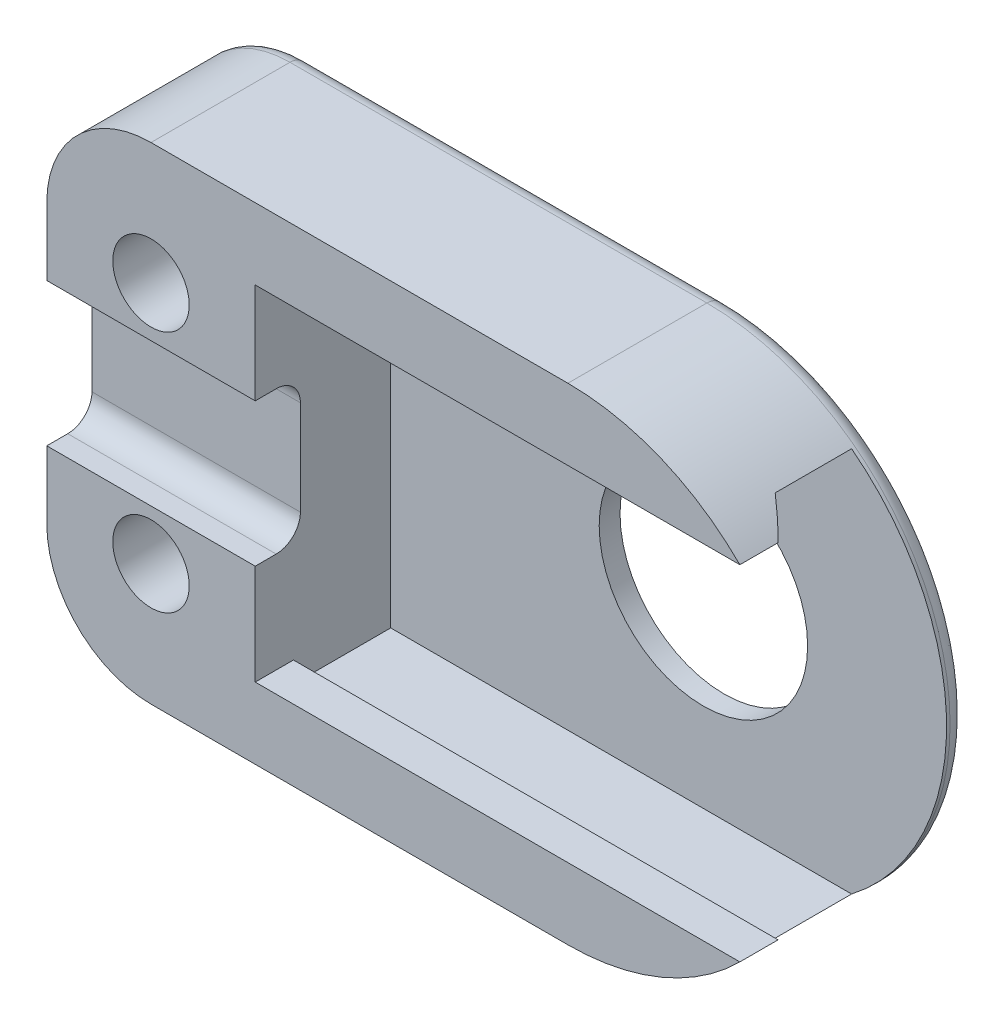
ISO-10303-21;
HEADER;
FILE_DESCRIPTION(('STEP AP214'),'2;1');
FILE_NAME('part.step','',(''),(''),'','','');
FILE_SCHEMA(('AUTOMOTIVE_DESIGN { 1 0 10303 214 1 1 1 1 }'));
ENDSEC;
DATA;
#1=APPLICATION_CONTEXT('core data for automotive mechanical design processes');
#2=APPLICATION_PROTOCOL_DEFINITION('international standard','automotive_design',2000,#1);
#3=PRODUCT_CONTEXT('',#1,'mechanical');
#4=PRODUCT('Part','Part','',(#3));
#5=PRODUCT_RELATED_PRODUCT_CATEGORY('part','',(#4));
#6=PRODUCT_DEFINITION_FORMATION('','',#4);
#7=PRODUCT_DEFINITION_CONTEXT('part definition',#1,'design');
#8=PRODUCT_DEFINITION('design','',#6,#7);
#9=PRODUCT_DEFINITION_SHAPE('','',#8);
#10=(LENGTH_UNIT() NAMED_UNIT(*) SI_UNIT(.MILLI.,.METRE.));
#11=(NAMED_UNIT(*) PLANE_ANGLE_UNIT() SI_UNIT($,.RADIAN.));
#12=(NAMED_UNIT(*) SI_UNIT($,.STERADIAN.) SOLID_ANGLE_UNIT());
#13=UNCERTAINTY_MEASURE_WITH_UNIT(LENGTH_MEASURE(1.E-05),#10,'distance_accuracy_value','');
#14=(GEOMETRIC_REPRESENTATION_CONTEXT(3) GLOBAL_UNCERTAINTY_ASSIGNED_CONTEXT((#13)) GLOBAL_UNIT_ASSIGNED_CONTEXT((#10,
#11,#12)) REPRESENTATION_CONTEXT('',''));
#15=CARTESIAN_POINT('',(0.,0.,0.));
#16=DIRECTION('',(0.,0.,1.));
#17=DIRECTION('',(1.,0.,0.));
#18=AXIS2_PLACEMENT_3D('',#15,#16,#17);
#19=CARTESIAN_POINT('',(0.,0.,4.5));
#20=DIRECTION('',(0.,0.,-1.));
#21=DIRECTION('',(-1.,0.,0.));
#22=AXIS2_PLACEMENT_3D('',#19,#20,#21);
#23=PLANE('',#22);
#24=CARTESIAN_POINT('',(-12.,3.5,4.5));
#25=DIRECTION('',(0.,0.,1.));
#26=DIRECTION('',(1.,0.,0.));
#27=AXIS2_PLACEMENT_3D('',#24,#25,#26);
#28=CIRCLE('',#27,1.1);
#29=CARTESIAN_POINT('',(-10.9,3.5,4.5));
#30=VERTEX_POINT('',#29);
#31=EDGE_CURVE('E285',#30,#30,#28,.T.);
#32=ORIENTED_EDGE('',*,*,#31,.F.);
#33=EDGE_LOOP('',(#32));
#34=FACE_BOUND('',#33,.T.);
#35=DIRECTION('',(-1.,0.,0.));
#36=VECTOR('',#35,1.);
#37=CARTESIAN_POINT('',(-15.,7.,4.5));
#38=LINE('',#37,#36);
#39=CARTESIAN_POINT('',(0.,7.,4.5));
#40=VERTEX_POINT('',#39);
#41=CARTESIAN_POINT('',(-12.,7.,4.5));
#42=VERTEX_POINT('',#41);
#43=EDGE_CURVE('E292',#40,#42,#38,.T.);
#44=ORIENTED_EDGE('',*,*,#43,.T.);
#45=CARTESIAN_POINT('',(-12.,4.,4.5));
#46=DIRECTION('',(0.,0.,-1.));
#47=DIRECTION('',(-1.,0.,0.));
#48=AXIS2_PLACEMENT_3D('',#45,#46,#47);
#49=CIRCLE('',#48,3.);
#50=CARTESIAN_POINT('',(-15.,4.,4.5));
#51=VERTEX_POINT('',#50);
#52=EDGE_CURVE('E341',#42,#51,#49,.F.);
#53=ORIENTED_EDGE('',*,*,#52,.T.);
#54=DIRECTION('',(0.,-1.,0.));
#55=VECTOR('',#54,1.);
#56=CARTESIAN_POINT('',(-15.,7.,4.5));
#57=LINE('',#56,#55);
#58=CARTESIAN_POINT('',(-15.,2.06,4.5));
#59=VERTEX_POINT('',#58);
#60=EDGE_CURVE('E296',#51,#59,#57,.T.);
#61=ORIENTED_EDGE('',*,*,#60,.T.);
#62=DIRECTION('',(-1.,0.,0.));
#63=VECTOR('',#62,1.);
#64=CARTESIAN_POINT('',(7.,2.06,4.5));
#65=LINE('',#64,#63);
#66=CARTESIAN_POINT('',(-9.,2.06,4.5));
#67=VERTEX_POINT('',#66);
#68=EDGE_CURVE('E208',#67,#59,#65,.T.);
#69=ORIENTED_EDGE('',*,*,#68,.F.);
#70=DIRECTION('',(0.,1.,0.));
#71=VECTOR('',#70,1.);
#72=CARTESIAN_POINT('',(-9.,0.,4.5));
#73=LINE('',#72,#71);
#74=CARTESIAN_POINT('',(-9.,4.95,4.5));
#75=VERTEX_POINT('',#74);
#76=EDGE_CURVE('E245',#67,#75,#73,.T.);
#77=ORIENTED_EDGE('',*,*,#76,.T.);
#78=DIRECTION('',(-1.,0.,0.));
#79=VECTOR('',#78,1.);
#80=CARTESIAN_POINT('',(7.,4.95,4.5));
#81=LINE('',#80,#79);
#82=CARTESIAN_POINT('',(4.94949492372707,4.95,4.5));
#83=VERTEX_POINT('',#82);
#84=EDGE_CURVE('E266',#83,#75,#81,.T.);
#85=ORIENTED_EDGE('',*,*,#84,.F.);
#86=CARTESIAN_POINT('',(0.,0.,4.5));
#87=DIRECTION('',(0.,0.,1.));
#88=DIRECTION('',(-1.,0.,0.));
#89=AXIS2_PLACEMENT_3D('',#86,#87,#88);
#90=CIRCLE('',#89,7.);
#91=EDGE_CURVE('E288',#83,#40,#90,.T.);
#92=ORIENTED_EDGE('',*,*,#91,.T.);
#93=EDGE_LOOP('',(#44,#53,#61,#69,#77,#85,#92));
#94=FACE_BOUND('',#93,.T.);
#95=ADVANCED_FACE('F34',(#34,#94),#23,.F.);
#96=CARTESIAN_POINT('',(-12.,-3.5,4.5));
#97=DIRECTION('',(0.,0.,1.));
#98=DIRECTION('',(-1.,0.,0.));
#99=AXIS2_PLACEMENT_3D('',#96,#97,#98);
#100=CIRCLE('',#99,1.1);
#101=CARTESIAN_POINT('',(-13.1,-3.5,4.5));
#102=VERTEX_POINT('',#101);
#103=EDGE_CURVE('E282',#102,#102,#100,.T.);
#104=ORIENTED_EDGE('',*,*,#103,.F.);
#105=EDGE_LOOP('',(#104));
#106=FACE_BOUND('',#105,.T.);
#107=CARTESIAN_POINT('',(-15.,-2.06,4.5));
#108=VERTEX_POINT('',#107);
#109=CARTESIAN_POINT('',(-15.,-4.,4.5));
#110=VERTEX_POINT('',#109);
#111=EDGE_CURVE('E295',#108,#110,#57,.T.);
#112=ORIENTED_EDGE('',*,*,#111,.T.);
#113=CARTESIAN_POINT('',(-12.,-4.,4.5));
#114=DIRECTION('',(0.,0.,-1.));
#115=DIRECTION('',(-1.,0.,0.));
#116=AXIS2_PLACEMENT_3D('',#113,#114,#115);
#117=CIRCLE('',#116,3.);
#118=CARTESIAN_POINT('',(-12.,-7.,4.5));
#119=VERTEX_POINT('',#118);
#120=EDGE_CURVE('E345',#110,#119,#117,.F.);
#121=ORIENTED_EDGE('',*,*,#120,.T.);
#122=DIRECTION('',(1.,0.,0.));
#123=VECTOR('',#122,1.);
#124=CARTESIAN_POINT('',(-15.,-7.,4.5));
#125=LINE('',#124,#123);
#126=CARTESIAN_POINT('',(0.,-7.,4.5));
#127=VERTEX_POINT('',#126);
#128=EDGE_CURVE('E298',#119,#127,#125,.T.);
#129=ORIENTED_EDGE('',*,*,#128,.T.);
#130=CARTESIAN_POINT('',(4.94949492372707,-4.95,4.5));
#131=VERTEX_POINT('',#130);
#132=EDGE_CURVE('E289',#127,#131,#90,.T.);
#133=ORIENTED_EDGE('',*,*,#132,.T.);
#134=DIRECTION('',(-1.,0.,0.));
#135=VECTOR('',#134,1.);
#136=CARTESIAN_POINT('',(7.,-4.95,4.5));
#137=LINE('',#136,#135);
#138=CARTESIAN_POINT('',(-9.,-4.95,4.5));
#139=VERTEX_POINT('',#138);
#140=EDGE_CURVE('E269',#131,#139,#137,.T.);
#141=ORIENTED_EDGE('',*,*,#140,.T.);
#142=CARTESIAN_POINT('',(-9.,-2.06,4.5));
#143=VERTEX_POINT('',#142);
#144=EDGE_CURVE('E246',#139,#143,#73,.T.);
#145=ORIENTED_EDGE('',*,*,#144,.T.);
#146=DIRECTION('',(-1.,0.,0.));
#147=VECTOR('',#146,1.);
#148=CARTESIAN_POINT('',(7.,-2.06,4.5));
#149=LINE('',#148,#147);
#150=EDGE_CURVE('E226',#143,#108,#149,.T.);
#151=ORIENTED_EDGE('',*,*,#150,.T.);
#152=EDGE_LOOP('',(#112,#121,#129,#133,#141,#145,#151));
#153=FACE_BOUND('',#152,.T.);
#154=ADVANCED_FACE('F424',(#106,#153),#23,.F.);
#155=CARTESIAN_POINT('',(0.,0.,0.));
#156=DIRECTION('',(0.,0.,-1.));
#157=DIRECTION('',(-1.,0.,0.));
#158=AXIS2_PLACEMENT_3D('',#155,#156,#157);
#159=PLANE('',#158);
#160=CARTESIAN_POINT('',(-12.,3.5,0.));
#161=DIRECTION('',(0.,0.,1.));
#162=DIRECTION('',(1.,0.,0.));
#163=AXIS2_PLACEMENT_3D('',#160,#161,#162);
#164=CIRCLE('',#163,1.75);
#165=CARTESIAN_POINT('',(-10.25,3.5,0.));
#166=VERTEX_POINT('',#165);
#167=EDGE_CURVE('E391',#166,#166,#164,.T.);
#168=ORIENTED_EDGE('',*,*,#167,.T.);
#169=EDGE_LOOP('',(#168));
#170=FACE_BOUND('',#169,.T.);
#171=CARTESIAN_POINT('',(-12.,-3.5,0.));
#172=DIRECTION('',(0.,0.,1.));
#173=DIRECTION('',(1.,0.,0.));
#174=AXIS2_PLACEMENT_3D('',#171,#172,#173);
#175=CIRCLE('',#174,1.75);
#176=CARTESIAN_POINT('',(-10.25,-3.5,0.));
#177=VERTEX_POINT('',#176);
#178=EDGE_CURVE('E400',#177,#177,#175,.T.);
#179=ORIENTED_EDGE('',*,*,#178,.T.);
#180=EDGE_LOOP('',(#179));
#181=FACE_BOUND('',#180,.T.);
#182=DIRECTION('',(0.,-1.,0.));
#183=VECTOR('',#182,1.);
#184=CARTESIAN_POINT('',(-14.5,4.,0.));
#185=LINE('',#184,#183);
#186=CARTESIAN_POINT('',(-14.5,-4.,0.));
#187=VERTEX_POINT('',#186);
#188=CARTESIAN_POINT('',(-14.5,4.,0.));
#189=VERTEX_POINT('',#188);
#190=EDGE_CURVE('E347',#187,#189,#185,.F.);
#191=ORIENTED_EDGE('',*,*,#190,.T.);
#192=CARTESIAN_POINT('',(-12.,4.,0.));
#193=DIRECTION('',(0.,0.,-1.));
#194=DIRECTION('',(-1.,0.,0.));
#195=AXIS2_PLACEMENT_3D('',#192,#193,#194);
#196=CIRCLE('',#195,2.5);
#197=CARTESIAN_POINT('',(-12.,6.5,0.));
#198=VERTEX_POINT('',#197);
#199=EDGE_CURVE('E357',#189,#198,#196,.T.);
#200=ORIENTED_EDGE('',*,*,#199,.T.);
#201=DIRECTION('',(-1.,0.,0.));
#202=VECTOR('',#201,1.);
#203=CARTESIAN_POINT('',(0.,6.5,0.));
#204=LINE('',#203,#202);
#205=CARTESIAN_POINT('',(0.,6.5,0.));
#206=VERTEX_POINT('',#205);
#207=EDGE_CURVE('E355',#198,#206,#204,.F.);
#208=ORIENTED_EDGE('',*,*,#207,.T.);
#209=CARTESIAN_POINT('',(0.,0.,0.));
#210=DIRECTION('',(0.,0.,-1.));
#211=DIRECTION('',(-1.,0.,0.));
#212=AXIS2_PLACEMENT_3D('',#209,#210,#211);
#213=CIRCLE('',#212,6.5);
#214=CARTESIAN_POINT('',(0.,-6.5,0.));
#215=VERTEX_POINT('',#214);
#216=EDGE_CURVE('E353',#206,#215,#213,.T.);
#217=ORIENTED_EDGE('',*,*,#216,.T.);
#218=DIRECTION('',(1.,0.,0.));
#219=VECTOR('',#218,1.);
#220=CARTESIAN_POINT('',(-12.,-6.5,0.));
#221=LINE('',#220,#219);
#222=CARTESIAN_POINT('',(-12.,-6.5,0.));
#223=VERTEX_POINT('',#222);
#224=EDGE_CURVE('E351',#215,#223,#221,.F.);
#225=ORIENTED_EDGE('',*,*,#224,.T.);
#226=CARTESIAN_POINT('',(-12.,-4.,0.));
#227=DIRECTION('',(0.,0.,-1.));
#228=DIRECTION('',(-1.,0.,0.));
#229=AXIS2_PLACEMENT_3D('',#226,#227,#228);
#230=CIRCLE('',#229,2.5);
#231=EDGE_CURVE('E349',#223,#187,#230,.T.);
#232=ORIENTED_EDGE('',*,*,#231,.T.);
#233=EDGE_LOOP('',(#191,#200,#208,#217,#225,#232));
#234=FACE_BOUND('',#233,.T.);
#235=CARTESIAN_POINT('',(0.,0.,0.));
#236=DIRECTION('',(0.,0.,-1.));
#237=DIRECTION('',(-1.,0.,0.));
#238=AXIS2_PLACEMENT_3D('',#235,#236,#237);
#239=CIRCLE('',#238,3.);
#240=CARTESIAN_POINT('',(-3.,0.,0.));
#241=VERTEX_POINT('',#240);
#242=EDGE_CURVE('E279',#241,#241,#239,.T.);
#243=ORIENTED_EDGE('',*,*,#242,.F.);
#244=EDGE_LOOP('',(#243));
#245=FACE_BOUND('',#244,.T.);
#246=ADVANCED_FACE('F404',(#170,#181,#234,#245),#159,.T.);
#247=CARTESIAN_POINT('',(0.,0.,4.5));
#248=DIRECTION('',(0.,0.,-1.));
#249=DIRECTION('',(-1.,0.,0.));
#250=AXIS2_PLACEMENT_3D('',#247,#248,#249);
#251=CYLINDRICAL_SURFACE('',#250,7.);
#252=DIRECTION('',(0.,0.,-1.));
#253=VECTOR('',#252,1.);
#254=CARTESIAN_POINT('',(0.,-7.,4.5));
#255=LINE('',#254,#253);
#256=CARTESIAN_POINT('',(0.,-7.,0.5));
#257=VERTEX_POINT('',#256);
#258=EDGE_CURVE('E300',#127,#257,#255,.T.);
#259=ORIENTED_EDGE('',*,*,#258,.T.);
#260=CARTESIAN_POINT('',(0.,0.,0.5));
#261=DIRECTION('',(0.,0.,-1.));
#262=DIRECTION('',(-1.,0.,0.));
#263=AXIS2_PLACEMENT_3D('',#260,#261,#262);
#264=CIRCLE('',#263,7.);
#265=CARTESIAN_POINT('',(0.,7.,0.5));
#266=VERTEX_POINT('',#265);
#267=EDGE_CURVE('E365',#257,#266,#264,.F.);
#268=ORIENTED_EDGE('',*,*,#267,.T.);
#269=DIRECTION('',(0.,0.,-1.));
#270=VECTOR('',#269,1.);
#271=CARTESIAN_POINT('',(0.,7.,4.5));
#272=LINE('',#271,#270);
#273=EDGE_CURVE('E303',#40,#266,#272,.T.);
#274=ORIENTED_EDGE('',*,*,#273,.F.);
#275=ORIENTED_EDGE('',*,*,#91,.F.);
#276=DIRECTION('',(0.,0.,-1.));
#277=VECTOR('',#276,1.);
#278=CARTESIAN_POINT('',(4.94949492372707,4.95,4.5));
#279=LINE('',#278,#277);
#280=CARTESIAN_POINT('',(4.94949492372707,4.95,3.40000000000002));
#281=VERTEX_POINT('',#280);
#282=EDGE_CURVE('E317',#281,#83,#279,.F.);
#283=ORIENTED_EDGE('',*,*,#282,.F.);
#284=CARTESIAN_POINT('',(0.,0.,8.35000000000015));
#285=DIRECTION('',(0.,-0.707106781186557,-0.707106781186538));
#286=DIRECTION('',(0.,0.707106781186538,-0.707106781186557));
#287=AXIS2_PLACEMENT_3D('',#284,#285,#286);
#288=ELLIPSE('',#287,9.8994949366118,7.);
#289=CARTESIAN_POINT('',(4.26585278695831,5.55,2.8));
#290=VERTEX_POINT('',#289);
#291=EDGE_CURVE('E319',#290,#281,#288,.T.);
#292=ORIENTED_EDGE('',*,*,#291,.F.);
#293=DIRECTION('',(0.,0.,-1.));
#294=VECTOR('',#293,1.);
#295=CARTESIAN_POINT('',(4.26585278695831,5.55,4.5));
#296=LINE('',#295,#294);
#297=CARTESIAN_POINT('',(4.26585278695831,5.55,0.6));
#298=VERTEX_POINT('',#297);
#299=EDGE_CURVE('E321',#298,#290,#296,.F.);
#300=ORIENTED_EDGE('',*,*,#299,.F.);
#301=CARTESIAN_POINT('',(0.,0.,0.6));
#302=DIRECTION('',(0.,0.,-1.));
#303=DIRECTION('',(-1.,0.,0.));
#304=AXIS2_PLACEMENT_3D('',#301,#302,#303);
#305=CIRCLE('',#304,7.);
#306=CARTESIAN_POINT('',(4.26585278695831,-5.55,0.6));
#307=VERTEX_POINT('',#306);
#308=EDGE_CURVE('E277',#298,#307,#305,.T.);
#309=ORIENTED_EDGE('',*,*,#308,.T.);
#310=DIRECTION('',(0.,0.,-1.));
#311=VECTOR('',#310,1.);
#312=CARTESIAN_POINT('',(4.26585278695831,-5.55,4.5));
#313=LINE('',#312,#311);
#314=CARTESIAN_POINT('',(4.26585278695831,-5.55,2.8));
#315=VERTEX_POINT('',#314);
#316=EDGE_CURVE('E306',#307,#315,#313,.F.);
#317=ORIENTED_EDGE('',*,*,#316,.T.);
#318=CARTESIAN_POINT('',(0.,0.,8.35000000000013));
#319=DIRECTION('',(0.,-0.707106781186556,0.707106781186539));
#320=DIRECTION('',(0.,-0.707106781186539,-0.707106781186556));
#321=AXIS2_PLACEMENT_3D('',#318,#319,#320);
#322=ELLIPSE('',#321,9.89949493661178,7.);
#323=CARTESIAN_POINT('',(4.94949492372707,-4.95,3.40000000000002));
#324=VERTEX_POINT('',#323);
#325=EDGE_CURVE('E311',#315,#324,#322,.T.);
#326=ORIENTED_EDGE('',*,*,#325,.T.);
#327=DIRECTION('',(0.,0.,-1.));
#328=VECTOR('',#327,1.);
#329=CARTESIAN_POINT('',(4.94949492372707,-4.95,4.5));
#330=LINE('',#329,#328);
#331=EDGE_CURVE('E314',#324,#131,#330,.F.);
#332=ORIENTED_EDGE('',*,*,#331,.T.);
#333=ORIENTED_EDGE('',*,*,#132,.F.);
#334=EDGE_LOOP('',(#259,#268,#274,#275,#283,#292,#300,#309,#317,#326,#332,#333));
#335=FACE_BOUND('',#334,.T.);
#336=ADVANCED_FACE('F439',(#335),#251,.T.);
#337=CARTESIAN_POINT('',(-15.,7.,4.5));
#338=DIRECTION('',(0.,-1.,0.));
#339=DIRECTION('',(0.,0.,-1.));
#340=AXIS2_PLACEMENT_3D('',#337,#338,#339);
#341=PLANE('',#340);
#342=ORIENTED_EDGE('',*,*,#273,.T.);
#343=DIRECTION('',(-1.,0.,0.));
#344=VECTOR('',#343,1.);
#345=CARTESIAN_POINT('',(-12.,7.,0.5));
#346=LINE('',#345,#344);
#347=CARTESIAN_POINT('',(-12.,7.,0.5));
#348=VERTEX_POINT('',#347);
#349=EDGE_CURVE('E363',#266,#348,#346,.T.);
#350=ORIENTED_EDGE('',*,*,#349,.T.);
#351=DIRECTION('',(0.,0.,-1.));
#352=VECTOR('',#351,1.);
#353=CARTESIAN_POINT('',(-12.,7.,4.5));
#354=LINE('',#353,#352);
#355=EDGE_CURVE('E339',#348,#42,#354,.F.);
#356=ORIENTED_EDGE('',*,*,#355,.T.);
#357=ORIENTED_EDGE('',*,*,#43,.F.);
#358=EDGE_LOOP('',(#342,#350,#356,#357));
#359=FACE_BOUND('',#358,.T.);
#360=ADVANCED_FACE('F447',(#359),#341,.F.);
#361=CARTESIAN_POINT('',(-15.,7.,4.5));
#362=DIRECTION('',(1.,0.,0.));
#363=DIRECTION('',(0.,1.,0.));
#364=AXIS2_PLACEMENT_3D('',#361,#362,#363);
#365=PLANE('',#364);
#366=DIRECTION('',(0.,0.,-1.));
#367=VECTOR('',#366,1.);
#368=CARTESIAN_POINT('',(-15.,4.,4.5));
#369=LINE('',#368,#367);
#370=CARTESIAN_POINT('',(-15.,4.,0.5));
#371=VERTEX_POINT('',#370);
#372=EDGE_CURVE('E337',#51,#371,#369,.T.);
#373=ORIENTED_EDGE('',*,*,#372,.T.);
#374=DIRECTION('',(0.,-1.,0.));
#375=VECTOR('',#374,1.);
#376=CARTESIAN_POINT('',(-15.,-4.,0.5));
#377=LINE('',#376,#375);
#378=CARTESIAN_POINT('',(-15.,-4.,0.5));
#379=VERTEX_POINT('',#378);
#380=EDGE_CURVE('E11',#371,#379,#377,.T.);
#381=ORIENTED_EDGE('',*,*,#380,.T.);
#382=DIRECTION('',(0.,0.,-1.));
#383=VECTOR('',#382,1.);
#384=CARTESIAN_POINT('',(-15.,-4.,4.5));
#385=LINE('',#384,#383);
#386=EDGE_CURVE('E335',#379,#110,#385,.F.);
#387=ORIENTED_EDGE('',*,*,#386,.T.);
#388=ORIENTED_EDGE('',*,*,#111,.F.);
#389=DIRECTION('',(0.,0.,1.));
#390=VECTOR('',#389,1.);
#391=CARTESIAN_POINT('',(-15.,-2.06,4.5));
#392=LINE('',#391,#390);
#393=CARTESIAN_POINT('',(-15.,-2.06,3.89665998448863));
#394=VERTEX_POINT('',#393);
#395=EDGE_CURVE('E201',#394,#108,#392,.T.);
#396=ORIENTED_EDGE('',*,*,#395,.F.);
#397=CARTESIAN_POINT('',(-15.,-1.36334001551137,3.89665998448863));
#398=DIRECTION('',(-1.,0.,0.));
#399=DIRECTION('',(0.,1.,0.));
#400=AXIS2_PLACEMENT_3D('',#397,#398,#399);
#401=CIRCLE('',#400,0.696659984488627);
#402=CARTESIAN_POINT('',(-15.,-1.36334001551137,3.2));
#403=VERTEX_POINT('',#402);
#404=EDGE_CURVE('E217',#403,#394,#401,.T.);
#405=ORIENTED_EDGE('',*,*,#404,.F.);
#406=DIRECTION('',(0.,-1.,0.));
#407=VECTOR('',#406,1.);
#408=CARTESIAN_POINT('',(-15.,1.36334001551137,3.2));
#409=LINE('',#408,#407);
#410=CARTESIAN_POINT('',(-15.,1.36334001551137,3.2));
#411=VERTEX_POINT('',#410);
#412=EDGE_CURVE('E215',#411,#403,#409,.T.);
#413=ORIENTED_EDGE('',*,*,#412,.F.);
#414=CARTESIAN_POINT('',(-15.,1.36334001551137,3.89665998448863));
#415=DIRECTION('',(-1.,0.,0.));
#416=DIRECTION('',(0.,-1.,0.));
#417=AXIS2_PLACEMENT_3D('',#414,#415,#416);
#418=CIRCLE('',#417,0.696659984488628);
#419=CARTESIAN_POINT('',(-15.,2.06,3.89665998448863));
#420=VERTEX_POINT('',#419);
#421=EDGE_CURVE('E194',#420,#411,#418,.T.);
#422=ORIENTED_EDGE('',*,*,#421,.F.);
#423=DIRECTION('',(0.,0.,-1.));
#424=VECTOR('',#423,1.);
#425=CARTESIAN_POINT('',(-15.,2.06,4.5));
#426=LINE('',#425,#424);
#427=EDGE_CURVE('E205',#59,#420,#426,.T.);
#428=ORIENTED_EDGE('',*,*,#427,.F.);
#429=ORIENTED_EDGE('',*,*,#60,.F.);
#430=EDGE_LOOP('',(#373,#381,#387,#388,#396,#405,#413,#422,#428,#429));
#431=FACE_BOUND('',#430,.T.);
#432=ADVANCED_FACE('F212',(#431),#365,.F.);
#433=CARTESIAN_POINT('',(-15.,-7.,4.5));
#434=DIRECTION('',(0.,1.,0.));
#435=DIRECTION('',(0.,0.,1.));
#436=AXIS2_PLACEMENT_3D('',#433,#434,#435);
#437=PLANE('',#436);
#438=DIRECTION('',(0.,0.,-1.));
#439=VECTOR('',#438,1.);
#440=CARTESIAN_POINT('',(-12.,-7.,4.5));
#441=LINE('',#440,#439);
#442=CARTESIAN_POINT('',(-12.,-7.,0.5));
#443=VERTEX_POINT('',#442);
#444=EDGE_CURVE('E343',#119,#443,#441,.T.);
#445=ORIENTED_EDGE('',*,*,#444,.T.);
#446=DIRECTION('',(1.,0.,0.));
#447=VECTOR('',#446,1.);
#448=CARTESIAN_POINT('',(0.,-7.,0.5));
#449=LINE('',#448,#447);
#450=EDGE_CURVE('E367',#443,#257,#449,.T.);
#451=ORIENTED_EDGE('',*,*,#450,.T.);
#452=ORIENTED_EDGE('',*,*,#258,.F.);
#453=ORIENTED_EDGE('',*,*,#128,.F.);
#454=EDGE_LOOP('',(#445,#451,#452,#453));
#455=FACE_BOUND('',#454,.T.);
#456=ADVANCED_FACE('F441',(#455),#437,.F.);
#457=CARTESIAN_POINT('',(-12.,3.5,4.5));
#458=DIRECTION('',(0.,0.,-1.));
#459=DIRECTION('',(-1.,0.,0.));
#460=AXIS2_PLACEMENT_3D('',#457,#458,#459);
#461=CYLINDRICAL_SURFACE('',#460,1.1);
#462=CARTESIAN_POINT('',(-12.,3.5,1.));
#463=DIRECTION('',(0.,0.,1.));
#464=DIRECTION('',(1.,0.,0.));
#465=AXIS2_PLACEMENT_3D('',#462,#463,#464);
#466=CIRCLE('',#465,1.1);
#467=CARTESIAN_POINT('',(-10.9,3.5,1.));
#468=VERTEX_POINT('',#467);
#469=EDGE_CURVE('E38',#468,#468,#466,.T.);
#470=ORIENTED_EDGE('',*,*,#469,.F.);
#471=EDGE_LOOP('',(#470));
#472=FACE_BOUND('',#471,.T.);
#473=ORIENTED_EDGE('',*,*,#31,.T.);
#474=EDGE_LOOP('',(#473));
#475=FACE_BOUND('',#474,.T.);
#476=ADVANCED_FACE('F435',(#472,#475),#461,.F.);
#477=CARTESIAN_POINT('',(-12.,-3.5,4.5));
#478=DIRECTION('',(0.,0.,-1.));
#479=DIRECTION('',(-1.,0.,0.));
#480=AXIS2_PLACEMENT_3D('',#477,#478,#479);
#481=CYLINDRICAL_SURFACE('',#480,1.1);
#482=CARTESIAN_POINT('',(-12.,-3.5,1.));
#483=DIRECTION('',(0.,0.,1.));
#484=DIRECTION('',(1.,0.,0.));
#485=AXIS2_PLACEMENT_3D('',#482,#483,#484);
#486=CIRCLE('',#485,1.1);
#487=CARTESIAN_POINT('',(-10.9,-3.5,1.));
#488=VERTEX_POINT('',#487);
#489=EDGE_CURVE('E384',#488,#488,#486,.T.);
#490=ORIENTED_EDGE('',*,*,#489,.F.);
#491=EDGE_LOOP('',(#490));
#492=FACE_BOUND('',#491,.T.);
#493=ORIENTED_EDGE('',*,*,#103,.T.);
#494=EDGE_LOOP('',(#493));
#495=FACE_BOUND('',#494,.T.);
#496=ADVANCED_FACE('F526',(#492,#495),#481,.F.);
#497=CARTESIAN_POINT('',(0.,0.,10.));
#498=DIRECTION('',(0.,0.,-1.));
#499=DIRECTION('',(-1.,0.,0.));
#500=AXIS2_PLACEMENT_3D('',#497,#498,#499);
#501=CYLINDRICAL_SURFACE('',#500,3.);
#502=CARTESIAN_POINT('',(0.,0.,0.6));
#503=DIRECTION('',(0.,0.,-1.));
#504=DIRECTION('',(-1.,0.,0.));
#505=AXIS2_PLACEMENT_3D('',#502,#503,#504);
#506=CIRCLE('',#505,3.);
#507=CARTESIAN_POINT('',(-3.,0.,0.6));
#508=VERTEX_POINT('',#507);
#509=EDGE_CURVE('E261',#508,#508,#506,.F.);
#510=ORIENTED_EDGE('',*,*,#509,.T.);
#511=EDGE_LOOP('',(#510));
#512=FACE_BOUND('',#511,.T.);
#513=ORIENTED_EDGE('',*,*,#242,.T.);
#514=EDGE_LOOP('',(#513));
#515=FACE_BOUND('',#514,.T.);
#516=ADVANCED_FACE('F523',(#512,#515),#501,.F.);
#517=CARTESIAN_POINT('',(7.,5.55,0.));
#518=DIRECTION('',(0.,-1.,0.));
#519=DIRECTION('',(0.,0.,-1.));
#520=AXIS2_PLACEMENT_3D('',#517,#518,#519);
#521=PLANE('',#520);
#522=ORIENTED_EDGE('',*,*,#299,.T.);
#523=DIRECTION('',(-1.,0.,0.));
#524=VECTOR('',#523,1.);
#525=CARTESIAN_POINT('',(7.,5.55,2.8));
#526=LINE('',#525,#524);
#527=CARTESIAN_POINT('',(-9.,5.55,2.8));
#528=VERTEX_POINT('',#527);
#529=EDGE_CURVE('E262',#290,#528,#526,.T.);
#530=ORIENTED_EDGE('',*,*,#529,.T.);
#531=DIRECTION('',(0.,0.,1.));
#532=VECTOR('',#531,1.);
#533=CARTESIAN_POINT('',(-9.,5.55,0.));
#534=LINE('',#533,#532);
#535=CARTESIAN_POINT('',(-9.,5.55,0.6));
#536=VERTEX_POINT('',#535);
#537=EDGE_CURVE('E255',#536,#528,#534,.T.);
#538=ORIENTED_EDGE('',*,*,#537,.F.);
#539=DIRECTION('',(-1.,0.,0.));
#540=VECTOR('',#539,1.);
#541=CARTESIAN_POINT('',(7.,5.55,0.6));
#542=LINE('',#541,#540);
#543=EDGE_CURVE('E259',#298,#536,#542,.T.);
#544=ORIENTED_EDGE('',*,*,#543,.F.);
#545=EDGE_LOOP('',(#522,#530,#538,#544));
#546=FACE_BOUND('',#545,.T.);
#547=ADVANCED_FACE('F525',(#546),#521,.T.);
#548=CARTESIAN_POINT('',(7.,4.17500000000007,4.17499999999996));
#549=DIRECTION('',(0.,-0.707106781186557,-0.707106781186538));
#550=DIRECTION('',(0.,0.707106781186538,-0.707106781186557));
#551=AXIS2_PLACEMENT_3D('',#548,#549,#550);
#552=PLANE('',#551);
#553=ORIENTED_EDGE('',*,*,#291,.T.);
#554=DIRECTION('',(-1.,0.,0.));
#555=VECTOR('',#554,1.);
#556=CARTESIAN_POINT('',(7.,4.95,3.40000000000002));
#557=LINE('',#556,#555);
#558=CARTESIAN_POINT('',(-9.,4.95,3.40000000000002));
#559=VERTEX_POINT('',#558);
#560=EDGE_CURVE('E264',#281,#559,#557,.T.);
#561=ORIENTED_EDGE('',*,*,#560,.T.);
#562=DIRECTION('',(0.,-0.707106781186538,0.707106781186557));
#563=VECTOR('',#562,1.);
#564=CARTESIAN_POINT('',(-9.,4.17500000000007,4.17499999999996));
#565=LINE('',#564,#563);
#566=EDGE_CURVE('E252',#528,#559,#565,.T.);
#567=ORIENTED_EDGE('',*,*,#566,.F.);
#568=ORIENTED_EDGE('',*,*,#529,.F.);
#569=EDGE_LOOP('',(#553,#561,#567,#568));
#570=FACE_BOUND('',#569,.T.);
#571=ADVANCED_FACE('F533',(#570),#552,.T.);
#572=CARTESIAN_POINT('',(7.,4.95,0.));
#573=DIRECTION('',(0.,-1.,0.));
#574=DIRECTION('',(1.,0.,0.));
#575=AXIS2_PLACEMENT_3D('',#572,#573,#574);
#576=PLANE('',#575);
#577=ORIENTED_EDGE('',*,*,#282,.T.);
#578=ORIENTED_EDGE('',*,*,#84,.T.);
#579=DIRECTION('',(0.,0.,1.));
#580=VECTOR('',#579,1.);
#581=CARTESIAN_POINT('',(-9.,4.95,0.));
#582=LINE('',#581,#580);
#583=EDGE_CURVE('E249',#559,#75,#582,.T.);
#584=ORIENTED_EDGE('',*,*,#583,.F.);
#585=ORIENTED_EDGE('',*,*,#560,.F.);
#586=EDGE_LOOP('',(#577,#578,#584,#585));
#587=FACE_BOUND('',#586,.T.);
#588=ADVANCED_FACE('F553',(#587),#576,.T.);
#589=CARTESIAN_POINT('',(7.,-4.95,0.));
#590=DIRECTION('',(0.,-1.,0.));
#591=DIRECTION('',(1.,0.,0.));
#592=AXIS2_PLACEMENT_3D('',#589,#590,#591);
#593=PLANE('',#592);
#594=DIRECTION('',(-1.,0.,0.));
#595=VECTOR('',#594,1.);
#596=CARTESIAN_POINT('',(7.,-4.95,3.40000000000002));
#597=LINE('',#596,#595);
#598=CARTESIAN_POINT('',(-9.,-4.95,3.40000000000002));
#599=VERTEX_POINT('',#598);
#600=EDGE_CURVE('E272',#324,#599,#597,.T.);
#601=ORIENTED_EDGE('',*,*,#600,.T.);
#602=DIRECTION('',(0.,0.,1.));
#603=VECTOR('',#602,1.);
#604=CARTESIAN_POINT('',(-9.,-4.95,0.));
#605=LINE('',#604,#603);
#606=EDGE_CURVE('E242',#599,#139,#605,.T.);
#607=ORIENTED_EDGE('',*,*,#606,.T.);
#608=ORIENTED_EDGE('',*,*,#140,.F.);
#609=ORIENTED_EDGE('',*,*,#331,.F.);
#610=EDGE_LOOP('',(#601,#607,#608,#609));
#611=FACE_BOUND('',#610,.T.);
#612=ADVANCED_FACE('F549',(#611),#593,.F.);
#613=CARTESIAN_POINT('',(7.,-4.17500000000007,4.17499999999997));
#614=DIRECTION('',(0.,-0.707106781186556,0.707106781186539));
#615=DIRECTION('',(0.,-0.707106781186539,-0.707106781186556));
#616=AXIS2_PLACEMENT_3D('',#613,#614,#615);
#617=PLANE('',#616);
#618=DIRECTION('',(-1.,0.,0.));
#619=VECTOR('',#618,1.);
#620=CARTESIAN_POINT('',(7.,-5.55,2.8));
#621=LINE('',#620,#619);
#622=CARTESIAN_POINT('',(-9.,-5.55,2.8));
#623=VERTEX_POINT('',#622);
#624=EDGE_CURVE('E274',#315,#623,#621,.T.);
#625=ORIENTED_EDGE('',*,*,#624,.T.);
#626=DIRECTION('',(0.,0.707106781186539,0.707106781186556));
#627=VECTOR('',#626,1.);
#628=CARTESIAN_POINT('',(-9.,-4.17500000000007,4.17499999999997));
#629=LINE('',#628,#627);
#630=EDGE_CURVE('E239',#623,#599,#629,.T.);
#631=ORIENTED_EDGE('',*,*,#630,.T.);
#632=ORIENTED_EDGE('',*,*,#600,.F.);
#633=ORIENTED_EDGE('',*,*,#325,.F.);
#634=EDGE_LOOP('',(#625,#631,#632,#633));
#635=FACE_BOUND('',#634,.T.);
#636=ADVANCED_FACE('F545',(#635),#617,.F.);
#637=CARTESIAN_POINT('',(7.,-5.55,0.));
#638=DIRECTION('',(0.,-1.,0.));
#639=DIRECTION('',(0.,0.,-1.));
#640=AXIS2_PLACEMENT_3D('',#637,#638,#639);
#641=PLANE('',#640);
#642=DIRECTION('',(-1.,0.,0.));
#643=VECTOR('',#642,1.);
#644=CARTESIAN_POINT('',(7.,-5.55,0.6));
#645=LINE('',#644,#643);
#646=CARTESIAN_POINT('',(-9.,-5.55,0.6));
#647=VERTEX_POINT('',#646);
#648=EDGE_CURVE('E258',#307,#647,#645,.T.);
#649=ORIENTED_EDGE('',*,*,#648,.T.);
#650=DIRECTION('',(0.,0.,1.));
#651=VECTOR('',#650,1.);
#652=CARTESIAN_POINT('',(-9.,-5.55,0.));
#653=LINE('',#652,#651);
#654=EDGE_CURVE('E236',#647,#623,#653,.T.);
#655=ORIENTED_EDGE('',*,*,#654,.T.);
#656=ORIENTED_EDGE('',*,*,#624,.F.);
#657=ORIENTED_EDGE('',*,*,#316,.F.);
#658=EDGE_LOOP('',(#649,#655,#656,#657));
#659=FACE_BOUND('',#658,.T.);
#660=ADVANCED_FACE('F541',(#659),#641,.F.);
#661=CARTESIAN_POINT('',(7.,0.,0.6));
#662=DIRECTION('',(0.,0.,-1.));
#663=DIRECTION('',(-1.,0.,0.));
#664=AXIS2_PLACEMENT_3D('',#661,#662,#663);
#665=PLANE('',#664);
#666=ORIENTED_EDGE('',*,*,#509,.F.);
#667=EDGE_LOOP('',(#666));
#668=FACE_BOUND('',#667,.T.);
#669=ORIENTED_EDGE('',*,*,#543,.T.);
#670=DIRECTION('',(0.,-1.,0.));
#671=VECTOR('',#670,1.);
#672=CARTESIAN_POINT('',(-9.,0.,0.6));
#673=LINE('',#672,#671);
#674=EDGE_CURVE('E225',#536,#647,#673,.T.);
#675=ORIENTED_EDGE('',*,*,#674,.T.);
#676=ORIENTED_EDGE('',*,*,#648,.F.);
#677=ORIENTED_EDGE('',*,*,#308,.F.);
#678=EDGE_LOOP('',(#669,#675,#676,#677));
#679=FACE_BOUND('',#678,.T.);
#680=ADVANCED_FACE('F538',(#668,#679),#665,.F.);
#681=CARTESIAN_POINT('',(-9.,0.,0.));
#682=DIRECTION('',(-1.,0.,0.));
#683=DIRECTION('',(0.,-1.,0.));
#684=AXIS2_PLACEMENT_3D('',#681,#682,#683);
#685=PLANE('',#684);
#686=ORIENTED_EDGE('',*,*,#76,.F.);
#687=DIRECTION('',(0.,0.,-1.));
#688=VECTOR('',#687,1.);
#689=CARTESIAN_POINT('',(-9.,2.06,0.));
#690=LINE('',#689,#688);
#691=CARTESIAN_POINT('',(-9.,2.06,3.89665998448863));
#692=VERTEX_POINT('',#691);
#693=EDGE_CURVE('E333',#67,#692,#690,.T.);
#694=ORIENTED_EDGE('',*,*,#693,.T.);
#695=CARTESIAN_POINT('',(-9.,1.36334001551137,3.89665998448863));
#696=DIRECTION('',(-1.,0.,0.));
#697=DIRECTION('',(0.,-1.,0.));
#698=AXIS2_PLACEMENT_3D('',#695,#696,#697);
#699=CIRCLE('',#698,0.696659984488628);
#700=CARTESIAN_POINT('',(-9.,1.36334001551137,3.2));
#701=VERTEX_POINT('',#700);
#702=EDGE_CURVE('E197',#692,#701,#699,.T.);
#703=ORIENTED_EDGE('',*,*,#702,.T.);
#704=DIRECTION('',(0.,-1.,0.));
#705=VECTOR('',#704,1.);
#706=CARTESIAN_POINT('',(-9.,0.,3.2));
#707=LINE('',#706,#705);
#708=CARTESIAN_POINT('',(-9.,-1.36334001551137,3.2));
#709=VERTEX_POINT('',#708);
#710=EDGE_CURVE('E324',#701,#709,#707,.T.);
#711=ORIENTED_EDGE('',*,*,#710,.T.);
#712=CARTESIAN_POINT('',(-9.,-1.36334001551137,3.89665998448863));
#713=DIRECTION('',(-1.,0.,0.));
#714=DIRECTION('',(0.,-1.,0.));
#715=AXIS2_PLACEMENT_3D('',#712,#713,#714);
#716=CIRCLE('',#715,0.696659984488627);
#717=CARTESIAN_POINT('',(-9.,-2.06,3.89665998448863));
#718=VERTEX_POINT('',#717);
#719=EDGE_CURVE('E327',#709,#718,#716,.T.);
#720=ORIENTED_EDGE('',*,*,#719,.T.);
#721=DIRECTION('',(0.,0.,1.));
#722=VECTOR('',#721,1.);
#723=CARTESIAN_POINT('',(-9.,-2.06000000000001,0.));
#724=LINE('',#723,#722);
#725=EDGE_CURVE('E330',#718,#143,#724,.T.);
#726=ORIENTED_EDGE('',*,*,#725,.T.);
#727=ORIENTED_EDGE('',*,*,#144,.F.);
#728=ORIENTED_EDGE('',*,*,#606,.F.);
#729=ORIENTED_EDGE('',*,*,#630,.F.);
#730=ORIENTED_EDGE('',*,*,#654,.F.);
#731=ORIENTED_EDGE('',*,*,#674,.F.);
#732=ORIENTED_EDGE('',*,*,#537,.T.);
#733=ORIENTED_EDGE('',*,*,#566,.T.);
#734=ORIENTED_EDGE('',*,*,#583,.T.);
#735=EDGE_LOOP('',(#686,#694,#703,#711,#720,#726,#727,#728,#729,#730,#731,#732,#733,#734));
#736=FACE_BOUND('',#735,.T.);
#737=ADVANCED_FACE('F499',(#736),#685,.F.);
#738=CARTESIAN_POINT('',(7.,2.06,4.5));
#739=DIRECTION('',(0.,1.,0.));
#740=DIRECTION('',(-1.,0.,0.));
#741=AXIS2_PLACEMENT_3D('',#738,#739,#740);
#742=PLANE('',#741);
#743=ORIENTED_EDGE('',*,*,#68,.T.);
#744=ORIENTED_EDGE('',*,*,#427,.T.);
#745=DIRECTION('',(-1.,0.,0.));
#746=VECTOR('',#745,1.);
#747=CARTESIAN_POINT('',(7.,2.06,3.89665998448863));
#748=LINE('',#747,#746);
#749=EDGE_CURVE('E190',#692,#420,#748,.T.);
#750=ORIENTED_EDGE('',*,*,#749,.F.);
#751=ORIENTED_EDGE('',*,*,#693,.F.);
#752=EDGE_LOOP('',(#743,#744,#750,#751));
#753=FACE_BOUND('',#752,.T.);
#754=ADVANCED_FACE('F206',(#753),#742,.F.);
#755=CARTESIAN_POINT('',(7.,-2.06,4.5));
#756=DIRECTION('',(0.,-1.,0.));
#757=DIRECTION('',(0.,0.,-1.));
#758=AXIS2_PLACEMENT_3D('',#755,#756,#757);
#759=PLANE('',#758);
#760=DIRECTION('',(-1.,0.,0.));
#761=VECTOR('',#760,1.);
#762=CARTESIAN_POINT('',(7.,-2.06,3.89665998448863));
#763=LINE('',#762,#761);
#764=EDGE_CURVE('E229',#718,#394,#763,.T.);
#765=ORIENTED_EDGE('',*,*,#764,.T.);
#766=ORIENTED_EDGE('',*,*,#395,.T.);
#767=ORIENTED_EDGE('',*,*,#150,.F.);
#768=ORIENTED_EDGE('',*,*,#725,.F.);
#769=EDGE_LOOP('',(#765,#766,#767,#768));
#770=FACE_BOUND('',#769,.T.);
#771=ADVANCED_FACE('F495',(#770),#759,.F.);
#772=CARTESIAN_POINT('',(7.,-1.36334001551137,3.89665998448863));
#773=DIRECTION('',(-1.,0.,0.));
#774=DIRECTION('',(0.,-1.,0.));
#775=AXIS2_PLACEMENT_3D('',#772,#773,#774);
#776=CYLINDRICAL_SURFACE('',#775,0.696659984488627);
#777=DIRECTION('',(-1.,0.,0.));
#778=VECTOR('',#777,1.);
#779=CARTESIAN_POINT('',(7.,-1.36334001551137,3.2));
#780=LINE('',#779,#778);
#781=EDGE_CURVE('E231',#709,#403,#780,.T.);
#782=ORIENTED_EDGE('',*,*,#781,.T.);
#783=ORIENTED_EDGE('',*,*,#404,.T.);
#784=ORIENTED_EDGE('',*,*,#764,.F.);
#785=ORIENTED_EDGE('',*,*,#719,.F.);
#786=EDGE_LOOP('',(#782,#783,#784,#785));
#787=FACE_BOUND('',#786,.T.);
#788=ADVANCED_FACE('F504',(#787),#776,.F.);
#789=CARTESIAN_POINT('',(7.,1.36334001551137,3.2));
#790=DIRECTION('',(0.,0.,-1.));
#791=DIRECTION('',(0.,1.,0.));
#792=AXIS2_PLACEMENT_3D('',#789,#790,#791);
#793=PLANE('',#792);
#794=DIRECTION('',(-1.,0.,0.));
#795=VECTOR('',#794,1.);
#796=CARTESIAN_POINT('',(7.,1.36334001551137,3.2));
#797=LINE('',#796,#795);
#798=EDGE_CURVE('E200',#701,#411,#797,.T.);
#799=ORIENTED_EDGE('',*,*,#798,.T.);
#800=ORIENTED_EDGE('',*,*,#412,.T.);
#801=ORIENTED_EDGE('',*,*,#781,.F.);
#802=ORIENTED_EDGE('',*,*,#710,.F.);
#803=EDGE_LOOP('',(#799,#800,#801,#802));
#804=FACE_BOUND('',#803,.T.);
#805=ADVANCED_FACE('F506',(#804),#793,.F.);
#806=CARTESIAN_POINT('',(7.,1.36334001551137,3.89665998448863));
#807=DIRECTION('',(-1.,0.,0.));
#808=DIRECTION('',(0.,-1.,0.));
#809=AXIS2_PLACEMENT_3D('',#806,#807,#808);
#810=CYLINDRICAL_SURFACE('',#809,0.696659984488628);
#811=ORIENTED_EDGE('',*,*,#749,.T.);
#812=ORIENTED_EDGE('',*,*,#421,.T.);
#813=ORIENTED_EDGE('',*,*,#798,.F.);
#814=ORIENTED_EDGE('',*,*,#702,.F.);
#815=EDGE_LOOP('',(#811,#812,#813,#814));
#816=FACE_BOUND('',#815,.T.);
#817=ADVANCED_FACE('F192',(#816),#810,.F.);
#818=CARTESIAN_POINT('',(-12.,4.,4.5));
#819=DIRECTION('',(0.,0.,-1.));
#820=DIRECTION('',(-1.,0.,0.));
#821=AXIS2_PLACEMENT_3D('',#818,#819,#820);
#822=CYLINDRICAL_SURFACE('',#821,3.);
#823=ORIENTED_EDGE('',*,*,#355,.F.);
#824=CARTESIAN_POINT('',(-12.,4.,0.5));
#825=DIRECTION('',(0.,0.,-1.));
#826=DIRECTION('',(-1.,0.,0.));
#827=AXIS2_PLACEMENT_3D('',#824,#825,#826);
#828=CIRCLE('',#827,3.);
#829=EDGE_CURVE('E360',#348,#371,#828,.F.);
#830=ORIENTED_EDGE('',*,*,#829,.T.);
#831=ORIENTED_EDGE('',*,*,#372,.F.);
#832=ORIENTED_EDGE('',*,*,#52,.F.);
#833=EDGE_LOOP('',(#823,#830,#831,#832));
#834=FACE_BOUND('',#833,.T.);
#835=ADVANCED_FACE('F454',(#834),#822,.T.);
#836=CARTESIAN_POINT('',(-12.,-4.,4.5));
#837=DIRECTION('',(0.,0.,-1.));
#838=DIRECTION('',(-1.,0.,0.));
#839=AXIS2_PLACEMENT_3D('',#836,#837,#838);
#840=CYLINDRICAL_SURFACE('',#839,3.);
#841=ORIENTED_EDGE('',*,*,#386,.F.);
#842=CARTESIAN_POINT('',(-12.,-4.,0.5));
#843=DIRECTION('',(0.,0.,-1.));
#844=DIRECTION('',(-1.,0.,0.));
#845=AXIS2_PLACEMENT_3D('',#842,#843,#844);
#846=CIRCLE('',#845,3.);
#847=EDGE_CURVE('E43',#379,#443,#846,.F.);
#848=ORIENTED_EDGE('',*,*,#847,.T.);
#849=ORIENTED_EDGE('',*,*,#444,.F.);
#850=ORIENTED_EDGE('',*,*,#120,.F.);
#851=EDGE_LOOP('',(#841,#848,#849,#850));
#852=FACE_BOUND('',#851,.T.);
#853=ADVANCED_FACE('F457',(#852),#840,.T.);
#854=CARTESIAN_POINT('',(-15.,-6.5,0.5));
#855=DIRECTION('',(-1.,0.,0.));
#856=DIRECTION('',(0.,0.,1.));
#857=AXIS2_PLACEMENT_3D('',#854,#855,#856);
#858=CYLINDRICAL_SURFACE('',#857,0.5);
#859=CARTESIAN_POINT('',(0.,-6.5,0.5));
#860=DIRECTION('',(1.,0.,0.));
#861=DIRECTION('',(0.,0.,-1.));
#862=AXIS2_PLACEMENT_3D('',#859,#860,#861);
#863=CIRCLE('',#862,0.5);
#864=EDGE_CURVE('E380',#257,#215,#863,.T.);
#865=ORIENTED_EDGE('',*,*,#864,.F.);
#866=ORIENTED_EDGE('',*,*,#450,.F.);
#867=CARTESIAN_POINT('',(-12.,-6.5,0.5));
#868=DIRECTION('',(-1.,0.,0.));
#869=DIRECTION('',(0.,0.,1.));
#870=AXIS2_PLACEMENT_3D('',#867,#868,#869);
#871=CIRCLE('',#870,0.5);
#872=EDGE_CURVE('E210',#223,#443,#871,.T.);
#873=ORIENTED_EDGE('',*,*,#872,.F.);
#874=ORIENTED_EDGE('',*,*,#224,.F.);
#875=EDGE_LOOP('',(#865,#866,#873,#874));
#876=FACE_BOUND('',#875,.T.);
#877=ADVANCED_FACE('F36',(#876),#858,.T.);
#878=CARTESIAN_POINT('',(-12.,-4.,0.5));
#879=DIRECTION('',(0.,0.,-1.));
#880=DIRECTION('',(-1.,0.,0.));
#881=AXIS2_PLACEMENT_3D('',#878,#879,#880);
#882=TOROIDAL_SURFACE('',#881,2.5,0.5);
#883=ORIENTED_EDGE('',*,*,#872,.T.);
#884=ORIENTED_EDGE('',*,*,#847,.F.);
#885=CARTESIAN_POINT('',(-14.5,-4.,0.5));
#886=DIRECTION('',(0.,1.,0.));
#887=DIRECTION('',(0.,0.,1.));
#888=AXIS2_PLACEMENT_3D('',#885,#886,#887);
#889=CIRCLE('',#888,0.5);
#890=EDGE_CURVE('E377',#187,#379,#889,.T.);
#891=ORIENTED_EDGE('',*,*,#890,.F.);
#892=ORIENTED_EDGE('',*,*,#231,.F.);
#893=EDGE_LOOP('',(#883,#884,#891,#892));
#894=FACE_BOUND('',#893,.T.);
#895=ADVANCED_FACE('F470',(#894),#882,.T.);
#896=CARTESIAN_POINT('',(0.,0.,0.5));
#897=DIRECTION('',(0.,0.,-1.));
#898=DIRECTION('',(-1.,0.,0.));
#899=AXIS2_PLACEMENT_3D('',#896,#897,#898);
#900=TOROIDAL_SURFACE('',#899,6.5,0.5);
#901=ORIENTED_EDGE('',*,*,#864,.T.);
#902=ORIENTED_EDGE('',*,*,#216,.F.);
#903=CARTESIAN_POINT('',(0.,6.5,0.5));
#904=DIRECTION('',(-1.,0.,0.));
#905=DIRECTION('',(0.,0.,1.));
#906=AXIS2_PLACEMENT_3D('',#903,#904,#905);
#907=CIRCLE('',#906,0.5);
#908=EDGE_CURVE('E374',#266,#206,#907,.T.);
#909=ORIENTED_EDGE('',*,*,#908,.F.);
#910=ORIENTED_EDGE('',*,*,#267,.F.);
#911=EDGE_LOOP('',(#901,#902,#909,#910));
#912=FACE_BOUND('',#911,.T.);
#913=ADVANCED_FACE('F467',(#912),#900,.T.);
#914=CARTESIAN_POINT('',(-14.5,7.,0.5));
#915=DIRECTION('',(0.,1.,0.));
#916=DIRECTION('',(-1.,0.,0.));
#917=AXIS2_PLACEMENT_3D('',#914,#915,#916);
#918=CYLINDRICAL_SURFACE('',#917,0.5);
#919=ORIENTED_EDGE('',*,*,#890,.T.);
#920=ORIENTED_EDGE('',*,*,#380,.F.);
#921=CARTESIAN_POINT('',(-14.5,4.,0.5));
#922=DIRECTION('',(0.,1.,0.));
#923=DIRECTION('',(0.,0.,1.));
#924=AXIS2_PLACEMENT_3D('',#921,#922,#923);
#925=CIRCLE('',#924,0.5);
#926=EDGE_CURVE('E372',#189,#371,#925,.T.);
#927=ORIENTED_EDGE('',*,*,#926,.F.);
#928=ORIENTED_EDGE('',*,*,#190,.F.);
#929=EDGE_LOOP('',(#919,#920,#927,#928));
#930=FACE_BOUND('',#929,.T.);
#931=ADVANCED_FACE('F463',(#930),#918,.T.);
#932=CARTESIAN_POINT('',(-15.,6.5,0.5));
#933=DIRECTION('',(1.,0.,0.));
#934=DIRECTION('',(0.,0.,-1.));
#935=AXIS2_PLACEMENT_3D('',#932,#933,#934);
#936=CYLINDRICAL_SURFACE('',#935,0.5);
#937=ORIENTED_EDGE('',*,*,#908,.T.);
#938=ORIENTED_EDGE('',*,*,#207,.F.);
#939=CARTESIAN_POINT('',(-12.,6.5,0.5));
#940=DIRECTION('',(-1.,0.,0.));
#941=DIRECTION('',(0.,0.,1.));
#942=AXIS2_PLACEMENT_3D('',#939,#940,#941);
#943=CIRCLE('',#942,0.5);
#944=EDGE_CURVE('E370',#348,#198,#943,.T.);
#945=ORIENTED_EDGE('',*,*,#944,.F.);
#946=ORIENTED_EDGE('',*,*,#349,.F.);
#947=EDGE_LOOP('',(#937,#938,#945,#946));
#948=FACE_BOUND('',#947,.T.);
#949=ADVANCED_FACE('F419',(#948),#936,.T.);
#950=CARTESIAN_POINT('',(-12.,4.,0.5));
#951=DIRECTION('',(0.,0.,-1.));
#952=DIRECTION('',(-1.,0.,0.));
#953=AXIS2_PLACEMENT_3D('',#950,#951,#952);
#954=TOROIDAL_SURFACE('',#953,2.5,0.5);
#955=ORIENTED_EDGE('',*,*,#926,.T.);
#956=ORIENTED_EDGE('',*,*,#829,.F.);
#957=ORIENTED_EDGE('',*,*,#944,.T.);
#958=ORIENTED_EDGE('',*,*,#199,.F.);
#959=EDGE_LOOP('',(#955,#956,#957,#958));
#960=FACE_BOUND('',#959,.T.);
#961=ADVANCED_FACE('F410',(#960),#954,.T.);
#962=CARTESIAN_POINT('',(-12.,-3.5,1.));
#963=DIRECTION('',(0.,0.,-1.));
#964=DIRECTION('',(-1.,0.,0.));
#965=AXIS2_PLACEMENT_3D('',#962,#963,#964);
#966=CYLINDRICAL_SURFACE('',#965,1.75);
#967=CARTESIAN_POINT('',(-12.,-3.5,1.));
#968=DIRECTION('',(0.,0.,1.));
#969=DIRECTION('',(1.,0.,0.));
#970=AXIS2_PLACEMENT_3D('',#967,#968,#969);
#971=CIRCLE('',#970,1.75);
#972=CARTESIAN_POINT('',(-10.25,-3.5,1.));
#973=VERTEX_POINT('',#972);
#974=EDGE_CURVE('E396',#973,#973,#971,.T.);
#975=ORIENTED_EDGE('',*,*,#974,.T.);
#976=EDGE_LOOP('',(#975));
#977=FACE_BOUND('',#976,.T.);
#978=ORIENTED_EDGE('',*,*,#178,.F.);
#979=EDGE_LOOP('',(#978));
#980=FACE_BOUND('',#979,.T.);
#981=ADVANCED_FACE('F407',(#977,#980),#966,.F.);
#982=CARTESIAN_POINT('',(-12.,-3.5,1.));
#983=DIRECTION('',(0.,0.,1.));
#984=DIRECTION('',(1.,0.,0.));
#985=AXIS2_PLACEMENT_3D('',#982,#983,#984);
#986=PLANE('',#985);
#987=ORIENTED_EDGE('',*,*,#489,.T.);
#988=EDGE_LOOP('',(#987));
#989=FACE_BOUND('',#988,.T.);
#990=ORIENTED_EDGE('',*,*,#974,.F.);
#991=EDGE_LOOP('',(#990));
#992=FACE_BOUND('',#991,.T.);
#993=ADVANCED_FACE('F409',(#989,#992),#986,.F.);
#994=CARTESIAN_POINT('',(-12.,3.5,1.));
#995=DIRECTION('',(0.,0.,-1.));
#996=DIRECTION('',(-1.,0.,0.));
#997=AXIS2_PLACEMENT_3D('',#994,#995,#996);
#998=CYLINDRICAL_SURFACE('',#997,1.75);
#999=CARTESIAN_POINT('',(-12.,3.5,1.));
#1000=DIRECTION('',(0.,0.,1.));
#1001=DIRECTION('',(1.,0.,0.));
#1002=AXIS2_PLACEMENT_3D('',#999,#1000,#1001);
#1003=CIRCLE('',#1002,1.75);
#1004=CARTESIAN_POINT('',(-10.25,3.5,1.));
#1005=VERTEX_POINT('',#1004);
#1006=EDGE_CURVE('E386',#1005,#1005,#1003,.T.);
#1007=ORIENTED_EDGE('',*,*,#1006,.T.);
#1008=EDGE_LOOP('',(#1007));
#1009=FACE_BOUND('',#1008,.T.);
#1010=ORIENTED_EDGE('',*,*,#167,.F.);
#1011=EDGE_LOOP('',(#1010));
#1012=FACE_BOUND('',#1011,.T.);
#1013=ADVANCED_FACE('F417',(#1009,#1012),#998,.F.);
#1014=CARTESIAN_POINT('',(-12.,3.5,1.));
#1015=DIRECTION('',(0.,0.,1.));
#1016=DIRECTION('',(1.,0.,0.));
#1017=AXIS2_PLACEMENT_3D('',#1014,#1015,#1016);
#1018=PLANE('',#1017);
#1019=ORIENTED_EDGE('',*,*,#469,.T.);
#1020=EDGE_LOOP('',(#1019));
#1021=FACE_BOUND('',#1020,.T.);
#1022=ORIENTED_EDGE('',*,*,#1006,.F.);
#1023=EDGE_LOOP('',(#1022));
#1024=FACE_BOUND('',#1023,.T.);
#1025=ADVANCED_FACE('F670',(#1021,#1024),#1018,.F.);
#1026=CLOSED_SHELL('',(#95,#154,#246,#336,#360,#432,#456,#476,#496,#516,#547,#571,#588,#612,
#636,#660,#680,#737,#754,#771,#788,#805,#817,#835,#853,#877,#895,#913,#931,#949,#961,#981,#993,
#1013,#1025));
#1027=MANIFOLD_SOLID_BREP('B2',#1026);
#1028=ADVANCED_BREP_SHAPE_REPRESENTATION('',(#18,#1027),#14);
#1029=SHAPE_DEFINITION_REPRESENTATION(#9,#1028);
ENDSEC;
END-ISO-10303-21;
